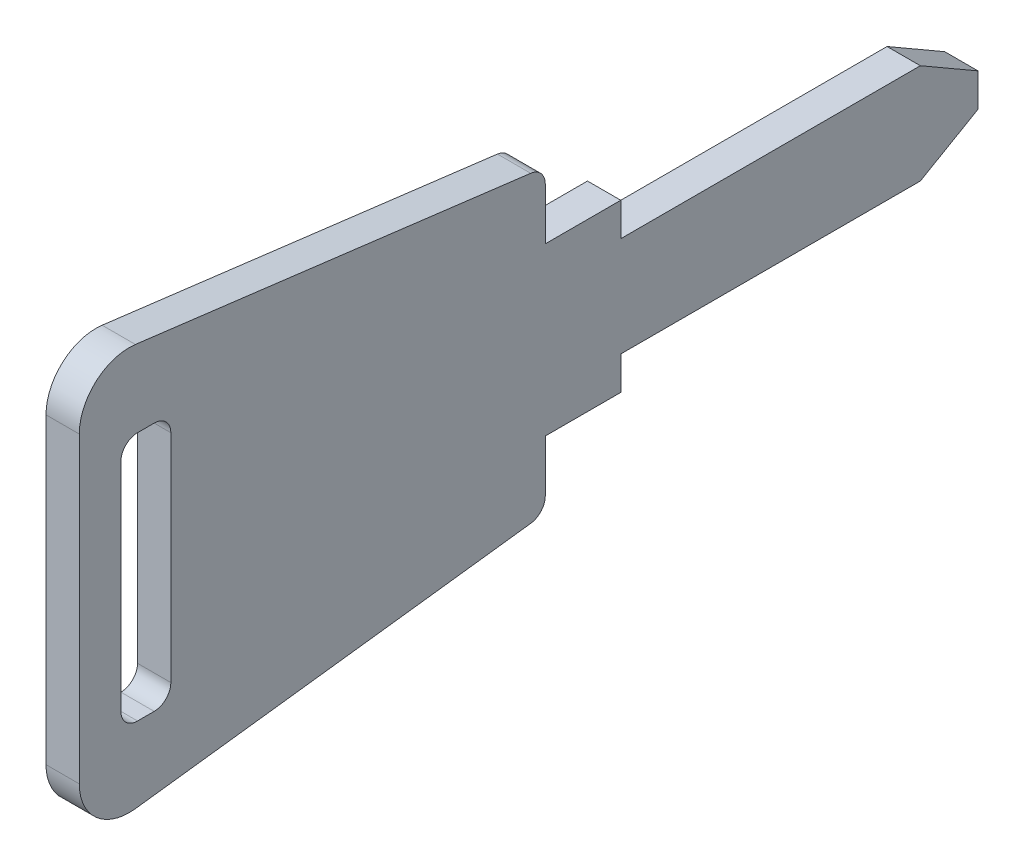
ISO-10303-21;
HEADER;
FILE_DESCRIPTION(('STEP AP214'),'2;1');
FILE_NAME('part.step','',(''),(''),'','','');
FILE_SCHEMA(('AUTOMOTIVE_DESIGN { 1 0 10303 214 1 1 1 1 }'));
ENDSEC;
DATA;
#1=APPLICATION_CONTEXT('core data for automotive mechanical design processes');
#2=APPLICATION_PROTOCOL_DEFINITION('international standard','automotive_design',2000,#1);
#3=PRODUCT_CONTEXT('',#1,'mechanical');
#4=PRODUCT('Part','Part','',(#3));
#5=PRODUCT_RELATED_PRODUCT_CATEGORY('part','',(#4));
#6=PRODUCT_DEFINITION_FORMATION('','',#4);
#7=PRODUCT_DEFINITION_CONTEXT('part definition',#1,'design');
#8=PRODUCT_DEFINITION('design','',#6,#7);
#9=PRODUCT_DEFINITION_SHAPE('','',#8);
#10=(LENGTH_UNIT() NAMED_UNIT(*) SI_UNIT(.MILLI.,.METRE.));
#11=(NAMED_UNIT(*) PLANE_ANGLE_UNIT() SI_UNIT($,.RADIAN.));
#12=(NAMED_UNIT(*) SI_UNIT($,.STERADIAN.) SOLID_ANGLE_UNIT());
#13=UNCERTAINTY_MEASURE_WITH_UNIT(LENGTH_MEASURE(1.E-05),#10,'distance_accuracy_value','');
#14=(GEOMETRIC_REPRESENTATION_CONTEXT(3) GLOBAL_UNCERTAINTY_ASSIGNED_CONTEXT((#13)) GLOBAL_UNIT_ASSIGNED_CONTEXT((#10,
#11,#12)) REPRESENTATION_CONTEXT('',''));
#15=CARTESIAN_POINT('',(0.,0.,0.));
#16=DIRECTION('',(0.,0.,1.));
#17=DIRECTION('',(1.,0.,0.));
#18=AXIS2_PLACEMENT_3D('',#15,#16,#17);
#19=CARTESIAN_POINT('',(2.,8.11721778146268,-27.));
#20=DIRECTION('',(-1.,0.,0.));
#21=DIRECTION('',(0.,0.,1.));
#22=AXIS2_PLACEMENT_3D('',#19,#20,#21);
#23=CYLINDRICAL_SURFACE('',#22,1.);
#24=CARTESIAN_POINT('',(0.,8.11721778146268,-27.));
#25=DIRECTION('',(1.,0.,0.));
#26=DIRECTION('',(0.,0.,-1.));
#27=AXIS2_PLACEMENT_3D('',#24,#25,#26);
#28=CIRCLE('',#27,1.);
#29=CARTESIAN_POINT('',(0.,9.10949565817635,-27.1240347345892));
#30=VERTEX_POINT('',#29);
#31=CARTESIAN_POINT('',(0.,8.11721778146268,-28.));
#32=VERTEX_POINT('',#31);
#33=EDGE_CURVE('E262',#30,#32,#28,.F.);
#34=ORIENTED_EDGE('',*,*,#33,.F.);
#35=DIRECTION('',(-1.,0.,0.));
#36=VECTOR('',#35,1.);
#37=CARTESIAN_POINT('',(2.,9.10949565817635,-27.1240347345892));
#38=LINE('',#37,#36);
#39=CARTESIAN_POINT('',(2.,9.10949565817635,-27.1240347345892));
#40=VERTEX_POINT('',#39);
#41=EDGE_CURVE('E11',#40,#30,#38,.T.);
#42=ORIENTED_EDGE('',*,*,#41,.F.);
#43=CARTESIAN_POINT('',(2.,8.11721778146268,-27.));
#44=DIRECTION('',(1.,0.,0.));
#45=DIRECTION('',(0.,0.,-1.));
#46=AXIS2_PLACEMENT_3D('',#43,#44,#45);
#47=CIRCLE('',#46,1.);
#48=CARTESIAN_POINT('',(2.,8.11721778146268,-28.));
#49=VERTEX_POINT('',#48);
#50=EDGE_CURVE('E274',#40,#49,#47,.F.);
#51=ORIENTED_EDGE('',*,*,#50,.T.);
#52=DIRECTION('',(-1.,0.,0.));
#53=VECTOR('',#52,1.);
#54=CARTESIAN_POINT('',(2.,8.11721778146268,-28.));
#55=LINE('',#54,#53);
#56=EDGE_CURVE('E321',#49,#32,#55,.T.);
#57=ORIENTED_EDGE('',*,*,#56,.T.);
#58=EDGE_LOOP('',(#34,#42,#51,#57));
#59=FACE_BOUND('',#58,.T.);
#60=ADVANCED_FACE('F34',(#59),#23,.T.);
#61=CARTESIAN_POINT('',(2.,12.3076923076923,-1.53846153846154));
#62=DIRECTION('',(0.,0.992277876713668,-0.124034734589208));
#63=DIRECTION('',(0.,0.124034734589208,0.992277876713668));
#64=AXIS2_PLACEMENT_3D('',#61,#62,#63);
#65=PLANE('',#64);
#66=DIRECTION('',(0.,-0.124034734589208,-0.992277876713668));
#67=VECTOR('',#66,1.);
#68=CARTESIAN_POINT('',(0.,12.3076923076923,-1.53846153846154));
#69=LINE('',#68,#67);
#70=CARTESIAN_POINT('',(0.,12.078486974529,-3.37210420376765));
#71=VERTEX_POINT('',#70);
#72=EDGE_CURVE('E324',#71,#30,#69,.T.);
#73=ORIENTED_EDGE('',*,*,#72,.F.);
#74=DIRECTION('',(-1.,0.,0.));
#75=VECTOR('',#74,1.);
#76=CARTESIAN_POINT('',(2.,12.078486974529,-3.37210420376765));
#77=LINE('',#76,#75);
#78=CARTESIAN_POINT('',(2.,12.078486974529,-3.37210420376765));
#79=VERTEX_POINT('',#78);
#80=EDGE_CURVE('E41',#79,#71,#77,.T.);
#81=ORIENTED_EDGE('',*,*,#80,.F.);
#82=DIRECTION('',(0.,-0.124034734589208,-0.992277876713668));
#83=VECTOR('',#82,1.);
#84=CARTESIAN_POINT('',(2.,12.3076923076923,-1.53846153846154));
#85=LINE('',#84,#83);
#86=EDGE_CURVE('E277',#79,#40,#85,.T.);
#87=ORIENTED_EDGE('',*,*,#86,.T.);
#88=ORIENTED_EDGE('',*,*,#41,.T.);
#89=EDGE_LOOP('',(#73,#81,#87,#88));
#90=FACE_BOUND('',#89,.T.);
#91=ADVANCED_FACE('F413',(#90),#65,.T.);
#92=CARTESIAN_POINT('',(2.,9.10165334438804,-3.));
#93=DIRECTION('',(-1.,0.,0.));
#94=DIRECTION('',(0.,0.,1.));
#95=AXIS2_PLACEMENT_3D('',#92,#93,#94);
#96=CYLINDRICAL_SURFACE('',#95,3.);
#97=CARTESIAN_POINT('',(0.,9.10165334438804,-3.));
#98=DIRECTION('',(1.,0.,0.));
#99=DIRECTION('',(0.,0.,-1.));
#100=AXIS2_PLACEMENT_3D('',#97,#98,#99);
#101=CIRCLE('',#100,3.);
#102=CARTESIAN_POINT('',(0.,9.10165334438802,0.));
#103=VERTEX_POINT('',#102);
#104=EDGE_CURVE('E327',#71,#103,#101,.T.);
#105=ORIENTED_EDGE('',*,*,#104,.T.);
#106=DIRECTION('',(-1.,0.,0.));
#107=VECTOR('',#106,1.);
#108=CARTESIAN_POINT('',(2.,9.10165334438802,0.));
#109=LINE('',#108,#107);
#110=CARTESIAN_POINT('',(2.,9.10165334438802,0.));
#111=VERTEX_POINT('',#110);
#112=EDGE_CURVE('E403',#111,#103,#109,.T.);
#113=ORIENTED_EDGE('',*,*,#112,.F.);
#114=CARTESIAN_POINT('',(2.,9.10165334438804,-3.));
#115=DIRECTION('',(1.,0.,0.));
#116=DIRECTION('',(0.,0.,-1.));
#117=AXIS2_PLACEMENT_3D('',#114,#115,#116);
#118=CIRCLE('',#117,3.);
#119=EDGE_CURVE('E281',#79,#111,#118,.T.);
#120=ORIENTED_EDGE('',*,*,#119,.F.);
#121=ORIENTED_EDGE('',*,*,#80,.T.);
#122=EDGE_LOOP('',(#105,#113,#120,#121));
#123=FACE_BOUND('',#122,.T.);
#124=ADVANCED_FACE('F407',(#123),#96,.T.);
#125=CARTESIAN_POINT('',(2.,0.,0.));
#126=DIRECTION('',(0.,0.,1.));
#127=DIRECTION('',(1.,0.,0.));
#128=AXIS2_PLACEMENT_3D('',#125,#126,#127);
#129=PLANE('',#128);
#130=DIRECTION('',(0.,1.,0.));
#131=VECTOR('',#130,1.);
#132=CARTESIAN_POINT('',(0.,0.,0.));
#133=LINE('',#132,#131);
#134=CARTESIAN_POINT('',(0.,-9.10165334438802,0.));
#135=VERTEX_POINT('',#134);
#136=EDGE_CURVE('E330',#135,#103,#133,.T.);
#137=ORIENTED_EDGE('',*,*,#136,.F.);
#138=DIRECTION('',(-1.,0.,0.));
#139=VECTOR('',#138,1.);
#140=CARTESIAN_POINT('',(2.,-9.10165334438802,0.));
#141=LINE('',#140,#139);
#142=CARTESIAN_POINT('',(2.,-9.10165334438802,0.));
#143=VERTEX_POINT('',#142);
#144=EDGE_CURVE('E401',#143,#135,#141,.T.);
#145=ORIENTED_EDGE('',*,*,#144,.F.);
#146=DIRECTION('',(0.,1.,0.));
#147=VECTOR('',#146,1.);
#148=CARTESIAN_POINT('',(2.,0.,0.));
#149=LINE('',#148,#147);
#150=EDGE_CURVE('E283',#143,#111,#149,.T.);
#151=ORIENTED_EDGE('',*,*,#150,.T.);
#152=ORIENTED_EDGE('',*,*,#112,.T.);
#153=EDGE_LOOP('',(#137,#145,#151,#152));
#154=FACE_BOUND('',#153,.T.);
#155=ADVANCED_FACE('F482',(#154),#129,.T.);
#156=CARTESIAN_POINT('',(2.,-9.10165334438804,-3.));
#157=DIRECTION('',(-1.,0.,0.));
#158=DIRECTION('',(0.,0.,1.));
#159=AXIS2_PLACEMENT_3D('',#156,#157,#158);
#160=CYLINDRICAL_SURFACE('',#159,3.);
#161=CARTESIAN_POINT('',(0.,-9.10165334438804,-3.));
#162=DIRECTION('',(1.,0.,0.));
#163=DIRECTION('',(0.,0.,-1.));
#164=AXIS2_PLACEMENT_3D('',#161,#162,#163);
#165=CIRCLE('',#164,3.);
#166=CARTESIAN_POINT('',(0.,-12.078486974529,-3.37210420376765));
#167=VERTEX_POINT('',#166);
#168=EDGE_CURVE('E333',#167,#135,#165,.F.);
#169=ORIENTED_EDGE('',*,*,#168,.F.);
#170=DIRECTION('',(-1.,0.,0.));
#171=VECTOR('',#170,1.);
#172=CARTESIAN_POINT('',(2.,-12.078486974529,-3.37210420376765));
#173=LINE('',#172,#171);
#174=CARTESIAN_POINT('',(2.,-12.078486974529,-3.37210420376765));
#175=VERTEX_POINT('',#174);
#176=EDGE_CURVE('E399',#175,#167,#173,.T.);
#177=ORIENTED_EDGE('',*,*,#176,.F.);
#178=CARTESIAN_POINT('',(2.,-9.10165334438804,-3.));
#179=DIRECTION('',(1.,0.,0.));
#180=DIRECTION('',(0.,0.,-1.));
#181=AXIS2_PLACEMENT_3D('',#178,#179,#180);
#182=CIRCLE('',#181,3.);
#183=EDGE_CURVE('E286',#175,#143,#182,.F.);
#184=ORIENTED_EDGE('',*,*,#183,.T.);
#185=ORIENTED_EDGE('',*,*,#144,.T.);
#186=EDGE_LOOP('',(#169,#177,#184,#185));
#187=FACE_BOUND('',#186,.T.);
#188=ADVANCED_FACE('F479',(#187),#160,.T.);
#189=CARTESIAN_POINT('',(2.,-12.3076923076923,-1.53846153846154));
#190=DIRECTION('',(0.,0.992277876713668,0.124034734589208));
#191=DIRECTION('',(0.,-0.124034734589208,0.992277876713668));
#192=AXIS2_PLACEMENT_3D('',#189,#190,#191);
#193=PLANE('',#192);
#194=DIRECTION('',(0.,0.124034734589208,-0.992277876713668));
#195=VECTOR('',#194,1.);
#196=CARTESIAN_POINT('',(0.,-12.3076923076923,-1.53846153846154));
#197=LINE('',#196,#195);
#198=CARTESIAN_POINT('',(0.,-9.10949565817635,-27.1240347345892));
#199=VERTEX_POINT('',#198);
#200=EDGE_CURVE('E336',#167,#199,#197,.T.);
#201=ORIENTED_EDGE('',*,*,#200,.T.);
#202=DIRECTION('',(-1.,0.,0.));
#203=VECTOR('',#202,1.);
#204=CARTESIAN_POINT('',(2.,-9.10949565817635,-27.1240347345892));
#205=LINE('',#204,#203);
#206=CARTESIAN_POINT('',(2.,-9.10949565817635,-27.1240347345892));
#207=VERTEX_POINT('',#206);
#208=EDGE_CURVE('E396',#207,#199,#205,.T.);
#209=ORIENTED_EDGE('',*,*,#208,.F.);
#210=DIRECTION('',(0.,0.124034734589208,-0.992277876713668));
#211=VECTOR('',#210,1.);
#212=CARTESIAN_POINT('',(2.,-12.3076923076923,-1.53846153846154));
#213=LINE('',#212,#211);
#214=EDGE_CURVE('E289',#175,#207,#213,.T.);
#215=ORIENTED_EDGE('',*,*,#214,.F.);
#216=ORIENTED_EDGE('',*,*,#176,.T.);
#217=EDGE_LOOP('',(#201,#209,#215,#216));
#218=FACE_BOUND('',#217,.T.);
#219=ADVANCED_FACE('F476',(#218),#193,.F.);
#220=CARTESIAN_POINT('',(2.,-8.11721778146268,-27.));
#221=DIRECTION('',(-1.,0.,0.));
#222=DIRECTION('',(0.,0.,1.));
#223=AXIS2_PLACEMENT_3D('',#220,#221,#222);
#224=CYLINDRICAL_SURFACE('',#223,1.);
#225=CARTESIAN_POINT('',(0.,-8.11721778146268,-27.));
#226=DIRECTION('',(1.,0.,0.));
#227=DIRECTION('',(0.,0.,-1.));
#228=AXIS2_PLACEMENT_3D('',#225,#226,#227);
#229=CIRCLE('',#228,1.);
#230=CARTESIAN_POINT('',(0.,-8.11721778146268,-28.));
#231=VERTEX_POINT('',#230);
#232=EDGE_CURVE('E338',#199,#231,#229,.T.);
#233=ORIENTED_EDGE('',*,*,#232,.T.);
#234=DIRECTION('',(-1.,0.,0.));
#235=VECTOR('',#234,1.);
#236=CARTESIAN_POINT('',(2.,-8.11721778146268,-28.));
#237=LINE('',#236,#235);
#238=CARTESIAN_POINT('',(2.,-8.11721778146268,-28.));
#239=VERTEX_POINT('',#238);
#240=EDGE_CURVE('E393',#239,#231,#237,.T.);
#241=ORIENTED_EDGE('',*,*,#240,.F.);
#242=CARTESIAN_POINT('',(2.,-8.11721778146268,-27.));
#243=DIRECTION('',(1.,0.,0.));
#244=DIRECTION('',(0.,0.,-1.));
#245=AXIS2_PLACEMENT_3D('',#242,#243,#244);
#246=CIRCLE('',#245,1.);
#247=EDGE_CURVE('E291',#207,#239,#246,.T.);
#248=ORIENTED_EDGE('',*,*,#247,.F.);
#249=ORIENTED_EDGE('',*,*,#208,.T.);
#250=EDGE_LOOP('',(#233,#241,#248,#249));
#251=FACE_BOUND('',#250,.T.);
#252=ADVANCED_FACE('F471',(#251),#224,.T.);
#253=CARTESIAN_POINT('',(2.,0.,-28.));
#254=DIRECTION('',(0.,0.,1.));
#255=DIRECTION('',(0.,-1.,0.));
#256=AXIS2_PLACEMENT_3D('',#253,#254,#255);
#257=PLANE('',#256);
#258=DIRECTION('',(0.,1.,0.));
#259=VECTOR('',#258,1.);
#260=CARTESIAN_POINT('',(0.,0.,-28.));
#261=LINE('',#260,#259);
#262=CARTESIAN_POINT('',(0.,-5.,-28.));
#263=VERTEX_POINT('',#262);
#264=EDGE_CURVE('E340',#231,#263,#261,.T.);
#265=ORIENTED_EDGE('',*,*,#264,.T.);
#266=DIRECTION('',(-1.,0.,0.));
#267=VECTOR('',#266,1.);
#268=CARTESIAN_POINT('',(2.,-5.,-28.));
#269=LINE('',#268,#267);
#270=CARTESIAN_POINT('',(2.,-5.,-28.));
#271=VERTEX_POINT('',#270);
#272=EDGE_CURVE('E390',#271,#263,#269,.T.);
#273=ORIENTED_EDGE('',*,*,#272,.F.);
#274=DIRECTION('',(0.,1.,0.));
#275=VECTOR('',#274,1.);
#276=CARTESIAN_POINT('',(2.,0.,-28.));
#277=LINE('',#276,#275);
#278=EDGE_CURVE('E293',#239,#271,#277,.T.);
#279=ORIENTED_EDGE('',*,*,#278,.F.);
#280=ORIENTED_EDGE('',*,*,#240,.T.);
#281=EDGE_LOOP('',(#265,#273,#279,#280));
#282=FACE_BOUND('',#281,.T.);
#283=ADVANCED_FACE('F465',(#282),#257,.F.);
#284=CARTESIAN_POINT('',(2.,-5.,0.));
#285=DIRECTION('',(0.,1.,0.));
#286=DIRECTION('',(0.,0.,1.));
#287=AXIS2_PLACEMENT_3D('',#284,#285,#286);
#288=PLANE('',#287);
#289=DIRECTION('',(0.,0.,-1.));
#290=VECTOR('',#289,1.);
#291=CARTESIAN_POINT('',(0.,-5.,0.));
#292=LINE('',#291,#290);
#293=CARTESIAN_POINT('',(0.,-5.00000000000001,-32.5358983848623));
#294=VERTEX_POINT('',#293);
#295=EDGE_CURVE('E342',#263,#294,#292,.T.);
#296=ORIENTED_EDGE('',*,*,#295,.T.);
#297=DIRECTION('',(-1.,0.,0.));
#298=VECTOR('',#297,1.);
#299=CARTESIAN_POINT('',(2.,-5.00000000000001,-32.5358983848623));
#300=LINE('',#299,#298);
#301=CARTESIAN_POINT('',(2.,-5.00000000000001,-32.5358983848623));
#302=VERTEX_POINT('',#301);
#303=EDGE_CURVE('E387',#302,#294,#300,.T.);
#304=ORIENTED_EDGE('',*,*,#303,.F.);
#305=DIRECTION('',(0.,0.,-1.));
#306=VECTOR('',#305,1.);
#307=CARTESIAN_POINT('',(2.,-5.,0.));
#308=LINE('',#307,#306);
#309=EDGE_CURVE('E295',#271,#302,#308,.T.);
#310=ORIENTED_EDGE('',*,*,#309,.F.);
#311=ORIENTED_EDGE('',*,*,#272,.T.);
#312=EDGE_LOOP('',(#296,#304,#310,#311));
#313=FACE_BOUND('',#312,.T.);
#314=ADVANCED_FACE('F461',(#313),#288,.F.);
#315=CARTESIAN_POINT('',(2.,0.,-32.5358983848623));
#316=DIRECTION('',(0.,0.,1.));
#317=DIRECTION('',(1.,0.,0.));
#318=AXIS2_PLACEMENT_3D('',#315,#316,#317);
#319=PLANE('',#318);
#320=DIRECTION('',(0.,1.,0.));
#321=VECTOR('',#320,1.);
#322=CARTESIAN_POINT('',(0.,0.,-32.5358983848623));
#323=LINE('',#322,#321);
#324=CARTESIAN_POINT('',(0.,-3.,-32.5358983848623));
#325=VERTEX_POINT('',#324);
#326=EDGE_CURVE('E344',#294,#325,#323,.T.);
#327=ORIENTED_EDGE('',*,*,#326,.T.);
#328=DIRECTION('',(-1.,0.,0.));
#329=VECTOR('',#328,1.);
#330=CARTESIAN_POINT('',(2.,-3.,-32.5358983848623));
#331=LINE('',#330,#329);
#332=CARTESIAN_POINT('',(2.,-3.,-32.5358983848623));
#333=VERTEX_POINT('',#332);
#334=EDGE_CURVE('E384',#333,#325,#331,.T.);
#335=ORIENTED_EDGE('',*,*,#334,.F.);
#336=DIRECTION('',(0.,1.,0.));
#337=VECTOR('',#336,1.);
#338=CARTESIAN_POINT('',(2.,0.,-32.5358983848623));
#339=LINE('',#338,#337);
#340=EDGE_CURVE('E297',#302,#333,#339,.T.);
#341=ORIENTED_EDGE('',*,*,#340,.F.);
#342=ORIENTED_EDGE('',*,*,#303,.T.);
#343=EDGE_LOOP('',(#327,#335,#341,#342));
#344=FACE_BOUND('',#343,.T.);
#345=ADVANCED_FACE('F456',(#344),#319,.F.);
#346=CARTESIAN_POINT('',(2.,-3.,0.));
#347=DIRECTION('',(0.,1.,0.));
#348=DIRECTION('',(0.,0.,1.));
#349=AXIS2_PLACEMENT_3D('',#346,#347,#348);
#350=PLANE('',#349);
#351=DIRECTION('',(0.,0.,-1.));
#352=VECTOR('',#351,1.);
#353=CARTESIAN_POINT('',(0.,-3.,0.));
#354=LINE('',#353,#352);
#355=CARTESIAN_POINT('',(0.,-3.00000000000001,-50.5358983848623));
#356=VERTEX_POINT('',#355);
#357=EDGE_CURVE('E346',#325,#356,#354,.T.);
#358=ORIENTED_EDGE('',*,*,#357,.T.);
#359=DIRECTION('',(-1.,0.,0.));
#360=VECTOR('',#359,1.);
#361=CARTESIAN_POINT('',(2.,-3.00000000000001,-50.5358983848623));
#362=LINE('',#361,#360);
#363=CARTESIAN_POINT('',(2.,-3.00000000000001,-50.5358983848623));
#364=VERTEX_POINT('',#363);
#365=EDGE_CURVE('E381',#364,#356,#362,.T.);
#366=ORIENTED_EDGE('',*,*,#365,.F.);
#367=DIRECTION('',(0.,0.,-1.));
#368=VECTOR('',#367,1.);
#369=CARTESIAN_POINT('',(2.,-3.,0.));
#370=LINE('',#369,#368);
#371=EDGE_CURVE('E299',#333,#364,#370,.T.);
#372=ORIENTED_EDGE('',*,*,#371,.F.);
#373=ORIENTED_EDGE('',*,*,#334,.T.);
#374=EDGE_LOOP('',(#358,#366,#372,#373));
#375=FACE_BOUND('',#374,.T.);
#376=ADVANCED_FACE('F450',(#375),#350,.F.);
#377=CARTESIAN_POINT('',(2.,-24.13268590218,-13.9330127018925));
#378=DIRECTION('',(0.,0.866025403784436,0.500000000000005));
#379=DIRECTION('',(0.,-0.500000000000005,0.866025403784436));
#380=AXIS2_PLACEMENT_3D('',#377,#378,#379);
#381=PLANE('',#380);
#382=DIRECTION('',(0.,0.500000000000005,-0.866025403784436));
#383=VECTOR('',#382,1.);
#384=CARTESIAN_POINT('',(0.,-24.13268590218,-13.9330127018925));
#385=LINE('',#384,#383);
#386=CARTESIAN_POINT('',(0.,-1.,-54.));
#387=VERTEX_POINT('',#386);
#388=EDGE_CURVE('E348',#356,#387,#385,.T.);
#389=ORIENTED_EDGE('',*,*,#388,.T.);
#390=DIRECTION('',(-1.,0.,0.));
#391=VECTOR('',#390,1.);
#392=CARTESIAN_POINT('',(2.,-1.,-54.));
#393=LINE('',#392,#391);
#394=CARTESIAN_POINT('',(2.,-1.,-54.));
#395=VERTEX_POINT('',#394);
#396=EDGE_CURVE('E379',#395,#387,#393,.T.);
#397=ORIENTED_EDGE('',*,*,#396,.F.);
#398=DIRECTION('',(0.,0.500000000000005,-0.866025403784436));
#399=VECTOR('',#398,1.);
#400=CARTESIAN_POINT('',(2.,-24.13268590218,-13.9330127018925));
#401=LINE('',#400,#399);
#402=EDGE_CURVE('E301',#364,#395,#401,.T.);
#403=ORIENTED_EDGE('',*,*,#402,.F.);
#404=ORIENTED_EDGE('',*,*,#365,.T.);
#405=EDGE_LOOP('',(#389,#397,#403,#404));
#406=FACE_BOUND('',#405,.T.);
#407=ADVANCED_FACE('F446',(#406),#381,.F.);
#408=CARTESIAN_POINT('',(2.,0.,-54.));
#409=DIRECTION('',(0.,0.,-1.));
#410=DIRECTION('',(-1.,0.,0.));
#411=AXIS2_PLACEMENT_3D('',#408,#409,#410);
#412=PLANE('',#411);
#413=DIRECTION('',(0.,-1.,0.));
#414=VECTOR('',#413,1.);
#415=CARTESIAN_POINT('',(0.,0.,-54.));
#416=LINE('',#415,#414);
#417=CARTESIAN_POINT('',(0.,0.999999999999997,-54.));
#418=VERTEX_POINT('',#417);
#419=EDGE_CURVE('E351',#418,#387,#416,.T.);
#420=ORIENTED_EDGE('',*,*,#419,.F.);
#421=DIRECTION('',(-1.,0.,0.));
#422=VECTOR('',#421,1.);
#423=CARTESIAN_POINT('',(2.,0.999999999999997,-54.));
#424=LINE('',#423,#422);
#425=CARTESIAN_POINT('',(2.,0.999999999999997,-54.));
#426=VERTEX_POINT('',#425);
#427=EDGE_CURVE('E377',#426,#418,#424,.T.);
#428=ORIENTED_EDGE('',*,*,#427,.F.);
#429=DIRECTION('',(0.,-1.,0.));
#430=VECTOR('',#429,1.);
#431=CARTESIAN_POINT('',(2.,0.,-54.));
#432=LINE('',#431,#430);
#433=EDGE_CURVE('E303',#426,#395,#432,.T.);
#434=ORIENTED_EDGE('',*,*,#433,.T.);
#435=ORIENTED_EDGE('',*,*,#396,.T.);
#436=EDGE_LOOP('',(#420,#428,#434,#435));
#437=FACE_BOUND('',#436,.T.);
#438=ADVANCED_FACE('F441',(#437),#412,.T.);
#439=CARTESIAN_POINT('',(2.,24.13268590218,-13.9330127018925));
#440=DIRECTION('',(0.,0.866025403784436,-0.500000000000005));
#441=DIRECTION('',(0.,0.500000000000005,0.866025403784436));
#442=AXIS2_PLACEMENT_3D('',#439,#440,#441);
#443=PLANE('',#442);
#444=DIRECTION('',(0.,-0.500000000000005,-0.866025403784436));
#445=VECTOR('',#444,1.);
#446=CARTESIAN_POINT('',(0.,24.13268590218,-13.9330127018925));
#447=LINE('',#446,#445);
#448=CARTESIAN_POINT('',(0.,3.00000000000001,-50.5358983848623));
#449=VERTEX_POINT('',#448);
#450=EDGE_CURVE('E354',#449,#418,#447,.T.);
#451=ORIENTED_EDGE('',*,*,#450,.F.);
#452=DIRECTION('',(-1.,0.,0.));
#453=VECTOR('',#452,1.);
#454=CARTESIAN_POINT('',(2.,3.00000000000001,-50.5358983848623));
#455=LINE('',#454,#453);
#456=CARTESIAN_POINT('',(2.,3.00000000000001,-50.5358983848623));
#457=VERTEX_POINT('',#456);
#458=EDGE_CURVE('E375',#457,#449,#455,.T.);
#459=ORIENTED_EDGE('',*,*,#458,.F.);
#460=DIRECTION('',(0.,-0.500000000000005,-0.866025403784436));
#461=VECTOR('',#460,1.);
#462=CARTESIAN_POINT('',(2.,24.13268590218,-13.9330127018925));
#463=LINE('',#462,#461);
#464=EDGE_CURVE('E306',#457,#426,#463,.T.);
#465=ORIENTED_EDGE('',*,*,#464,.T.);
#466=ORIENTED_EDGE('',*,*,#427,.T.);
#467=EDGE_LOOP('',(#451,#459,#465,#466));
#468=FACE_BOUND('',#467,.T.);
#469=ADVANCED_FACE('F436',(#468),#443,.T.);
#470=CARTESIAN_POINT('',(2.,3.,0.));
#471=DIRECTION('',(0.,1.,0.));
#472=DIRECTION('',(0.,0.,1.));
#473=AXIS2_PLACEMENT_3D('',#470,#471,#472);
#474=PLANE('',#473);
#475=DIRECTION('',(0.,0.,-1.));
#476=VECTOR('',#475,1.);
#477=CARTESIAN_POINT('',(0.,3.,0.));
#478=LINE('',#477,#476);
#479=CARTESIAN_POINT('',(0.,3.,-32.5358983848623));
#480=VERTEX_POINT('',#479);
#481=EDGE_CURVE('E357',#480,#449,#478,.T.);
#482=ORIENTED_EDGE('',*,*,#481,.F.);
#483=DIRECTION('',(-1.,0.,0.));
#484=VECTOR('',#483,1.);
#485=CARTESIAN_POINT('',(2.,3.,-32.5358983848623));
#486=LINE('',#485,#484);
#487=CARTESIAN_POINT('',(2.,3.,-32.5358983848623));
#488=VERTEX_POINT('',#487);
#489=EDGE_CURVE('E373',#488,#480,#486,.T.);
#490=ORIENTED_EDGE('',*,*,#489,.F.);
#491=DIRECTION('',(0.,0.,-1.));
#492=VECTOR('',#491,1.);
#493=CARTESIAN_POINT('',(2.,3.,0.));
#494=LINE('',#493,#492);
#495=EDGE_CURVE('E309',#488,#457,#494,.T.);
#496=ORIENTED_EDGE('',*,*,#495,.T.);
#497=ORIENTED_EDGE('',*,*,#458,.T.);
#498=EDGE_LOOP('',(#482,#490,#496,#497));
#499=FACE_BOUND('',#498,.T.);
#500=ADVANCED_FACE('F432',(#499),#474,.T.);
#501=CARTESIAN_POINT('',(2.,0.,-32.5358983848623));
#502=DIRECTION('',(0.,0.,-1.));
#503=DIRECTION('',(-1.,0.,0.));
#504=AXIS2_PLACEMENT_3D('',#501,#502,#503);
#505=PLANE('',#504);
#506=DIRECTION('',(0.,-1.,0.));
#507=VECTOR('',#506,1.);
#508=CARTESIAN_POINT('',(0.,0.,-32.5358983848623));
#509=LINE('',#508,#507);
#510=CARTESIAN_POINT('',(0.,5.00000000000001,-32.5358983848623));
#511=VERTEX_POINT('',#510);
#512=EDGE_CURVE('E360',#511,#480,#509,.T.);
#513=ORIENTED_EDGE('',*,*,#512,.F.);
#514=DIRECTION('',(-1.,0.,0.));
#515=VECTOR('',#514,1.);
#516=CARTESIAN_POINT('',(2.,5.00000000000001,-32.5358983848623));
#517=LINE('',#516,#515);
#518=CARTESIAN_POINT('',(2.,5.00000000000001,-32.5358983848623));
#519=VERTEX_POINT('',#518);
#520=EDGE_CURVE('E371',#519,#511,#517,.T.);
#521=ORIENTED_EDGE('',*,*,#520,.F.);
#522=DIRECTION('',(0.,-1.,0.));
#523=VECTOR('',#522,1.);
#524=CARTESIAN_POINT('',(2.,0.,-32.5358983848623));
#525=LINE('',#524,#523);
#526=EDGE_CURVE('E312',#519,#488,#525,.T.);
#527=ORIENTED_EDGE('',*,*,#526,.T.);
#528=ORIENTED_EDGE('',*,*,#489,.T.);
#529=EDGE_LOOP('',(#513,#521,#527,#528));
#530=FACE_BOUND('',#529,.T.);
#531=ADVANCED_FACE('F428',(#530),#505,.T.);
#532=CARTESIAN_POINT('',(2.,5.,0.));
#533=DIRECTION('',(0.,1.,0.));
#534=DIRECTION('',(0.,0.,1.));
#535=AXIS2_PLACEMENT_3D('',#532,#533,#534);
#536=PLANE('',#535);
#537=DIRECTION('',(0.,0.,-1.));
#538=VECTOR('',#537,1.);
#539=CARTESIAN_POINT('',(0.,5.,0.));
#540=LINE('',#539,#538);
#541=CARTESIAN_POINT('',(0.,5.,-28.));
#542=VERTEX_POINT('',#541);
#543=EDGE_CURVE('E363',#542,#511,#540,.T.);
#544=ORIENTED_EDGE('',*,*,#543,.F.);
#545=DIRECTION('',(-1.,0.,0.));
#546=VECTOR('',#545,1.);
#547=CARTESIAN_POINT('',(2.,5.,-28.));
#548=LINE('',#547,#546);
#549=CARTESIAN_POINT('',(2.,5.,-28.));
#550=VERTEX_POINT('',#549);
#551=EDGE_CURVE('E369',#550,#542,#548,.T.);
#552=ORIENTED_EDGE('',*,*,#551,.F.);
#553=DIRECTION('',(0.,0.,-1.));
#554=VECTOR('',#553,1.);
#555=CARTESIAN_POINT('',(2.,5.,0.));
#556=LINE('',#555,#554);
#557=EDGE_CURVE('E315',#550,#519,#556,.T.);
#558=ORIENTED_EDGE('',*,*,#557,.T.);
#559=ORIENTED_EDGE('',*,*,#520,.T.);
#560=EDGE_LOOP('',(#544,#552,#558,#559));
#561=FACE_BOUND('',#560,.T.);
#562=ADVANCED_FACE('F424',(#561),#536,.T.);
#563=CARTESIAN_POINT('',(2.,0.,-28.));
#564=DIRECTION('',(0.,0.,-1.));
#565=DIRECTION('',(0.,1.,0.));
#566=AXIS2_PLACEMENT_3D('',#563,#564,#565);
#567=PLANE('',#566);
#568=DIRECTION('',(0.,-1.,0.));
#569=VECTOR('',#568,1.);
#570=CARTESIAN_POINT('',(0.,0.,-28.));
#571=LINE('',#570,#569);
#572=EDGE_CURVE('E278',#32,#542,#571,.T.);
#573=ORIENTED_EDGE('',*,*,#572,.F.);
#574=ORIENTED_EDGE('',*,*,#56,.F.);
#575=DIRECTION('',(0.,-1.,0.));
#576=VECTOR('',#575,1.);
#577=CARTESIAN_POINT('',(2.,0.,-28.));
#578=LINE('',#577,#576);
#579=EDGE_CURVE('E318',#49,#550,#578,.T.);
#580=ORIENTED_EDGE('',*,*,#579,.T.);
#581=ORIENTED_EDGE('',*,*,#551,.T.);
#582=EDGE_LOOP('',(#573,#574,#580,#581));
#583=FACE_BOUND('',#582,.T.);
#584=ADVANCED_FACE('F419',(#583),#567,.T.);
#585=CARTESIAN_POINT('',(2.,0.,0.));
#586=DIRECTION('',(1.,0.,0.));
#587=DIRECTION('',(0.,0.,-1.));
#588=AXIS2_PLACEMENT_3D('',#585,#586,#587);
#589=PLANE('',#588);
#590=CARTESIAN_POINT('',(2.,-6.57848697452904,-4.5));
#591=DIRECTION('',(1.,0.,0.));
#592=DIRECTION('',(0.,0.,1.));
#593=AXIS2_PLACEMENT_3D('',#590,#591,#592);
#594=CIRCLE('',#593,1.);
#595=CARTESIAN_POINT('',(2.,-7.57848697452904,-4.49999999999999));
#596=VERTEX_POINT('',#595);
#597=CARTESIAN_POINT('',(2.,-6.57848697452904,-5.5));
#598=VERTEX_POINT('',#597);
#599=EDGE_CURVE('E48',#596,#598,#594,.T.);
#600=ORIENTED_EDGE('',*,*,#599,.F.);
#601=DIRECTION('',(0.,0.,-1.));
#602=VECTOR('',#601,1.);
#603=CARTESIAN_POINT('',(2.,-7.57848697452904,-4.49999999999999));
#604=LINE('',#603,#602);
#605=CARTESIAN_POINT('',(2.,-7.57848697452904,-3.50000000000001));
#606=VERTEX_POINT('',#605);
#607=EDGE_CURVE('E224',#606,#596,#604,.T.);
#608=ORIENTED_EDGE('',*,*,#607,.F.);
#609=CARTESIAN_POINT('',(2.,-6.57848697452904,-3.5));
#610=DIRECTION('',(1.,0.,0.));
#611=DIRECTION('',(0.,0.,-1.));
#612=AXIS2_PLACEMENT_3D('',#609,#610,#611);
#613=CIRCLE('',#612,1.);
#614=CARTESIAN_POINT('',(2.,-6.57848697452904,-2.5));
#615=VERTEX_POINT('',#614);
#616=EDGE_CURVE('E227',#615,#606,#613,.T.);
#617=ORIENTED_EDGE('',*,*,#616,.F.);
#618=DIRECTION('',(0.,-1.,0.));
#619=VECTOR('',#618,1.);
#620=CARTESIAN_POINT('',(2.,-6.57848697452904,-2.5));
#621=LINE('',#620,#619);
#622=CARTESIAN_POINT('',(2.,6.42151302547095,-2.5));
#623=VERTEX_POINT('',#622);
#624=EDGE_CURVE('E255',#623,#615,#621,.T.);
#625=ORIENTED_EDGE('',*,*,#624,.F.);
#626=CARTESIAN_POINT('',(2.,6.42151302547096,-3.5));
#627=DIRECTION('',(1.,0.,0.));
#628=DIRECTION('',(0.,0.,-1.));
#629=AXIS2_PLACEMENT_3D('',#626,#627,#628);
#630=CIRCLE('',#629,1.);
#631=CARTESIAN_POINT('',(2.,7.42151302547096,-3.50000000000001));
#632=VERTEX_POINT('',#631);
#633=EDGE_CURVE('E252',#632,#623,#630,.T.);
#634=ORIENTED_EDGE('',*,*,#633,.F.);
#635=DIRECTION('',(0.,0.,1.));
#636=VECTOR('',#635,1.);
#637=CARTESIAN_POINT('',(2.,7.42151302547096,-4.49999999999999));
#638=LINE('',#637,#636);
#639=CARTESIAN_POINT('',(2.,7.42151302547096,-4.49999999999999));
#640=VERTEX_POINT('',#639);
#641=EDGE_CURVE('E249',#640,#632,#638,.T.);
#642=ORIENTED_EDGE('',*,*,#641,.F.);
#643=CARTESIAN_POINT('',(2.,6.42151302547096,-4.5));
#644=DIRECTION('',(1.,0.,0.));
#645=DIRECTION('',(0.,0.,-1.));
#646=AXIS2_PLACEMENT_3D('',#643,#644,#645);
#647=CIRCLE('',#646,1.);
#648=CARTESIAN_POINT('',(2.,6.42151302547095,-5.5));
#649=VERTEX_POINT('',#648);
#650=EDGE_CURVE('E246',#649,#640,#647,.T.);
#651=ORIENTED_EDGE('',*,*,#650,.F.);
#652=DIRECTION('',(0.,1.,0.));
#653=VECTOR('',#652,1.);
#654=CARTESIAN_POINT('',(2.,-6.57848697452904,-5.5));
#655=LINE('',#654,#653);
#656=EDGE_CURVE('E244',#598,#649,#655,.T.);
#657=ORIENTED_EDGE('',*,*,#656,.F.);
#658=EDGE_LOOP('',(#600,#608,#617,#625,#634,#642,#651,#657));
#659=FACE_BOUND('',#658,.T.);
#660=ORIENTED_EDGE('',*,*,#50,.F.);
#661=ORIENTED_EDGE('',*,*,#86,.F.);
#662=ORIENTED_EDGE('',*,*,#119,.T.);
#663=ORIENTED_EDGE('',*,*,#150,.F.);
#664=ORIENTED_EDGE('',*,*,#183,.F.);
#665=ORIENTED_EDGE('',*,*,#214,.T.);
#666=ORIENTED_EDGE('',*,*,#247,.T.);
#667=ORIENTED_EDGE('',*,*,#278,.T.);
#668=ORIENTED_EDGE('',*,*,#309,.T.);
#669=ORIENTED_EDGE('',*,*,#340,.T.);
#670=ORIENTED_EDGE('',*,*,#371,.T.);
#671=ORIENTED_EDGE('',*,*,#402,.T.);
#672=ORIENTED_EDGE('',*,*,#433,.F.);
#673=ORIENTED_EDGE('',*,*,#464,.F.);
#674=ORIENTED_EDGE('',*,*,#495,.F.);
#675=ORIENTED_EDGE('',*,*,#526,.F.);
#676=ORIENTED_EDGE('',*,*,#557,.F.);
#677=ORIENTED_EDGE('',*,*,#579,.F.);
#678=EDGE_LOOP('',(#660,#661,#662,#663,#664,#665,#666,#667,#668,#669,#670,#671,#672,#673,#674,
#675,#676,#677));
#679=FACE_BOUND('',#678,.T.);
#680=ADVANCED_FACE('F484',(#659,#679),#589,.T.);
#681=CARTESIAN_POINT('',(0.,0.,0.));
#682=DIRECTION('',(1.,0.,0.));
#683=DIRECTION('',(0.,0.,-1.));
#684=AXIS2_PLACEMENT_3D('',#681,#682,#683);
#685=PLANE('',#684);
#686=DIRECTION('',(0.,0.,-1.));
#687=VECTOR('',#686,1.);
#688=CARTESIAN_POINT('',(0.,-7.57848697452904,-4.49999999999999));
#689=LINE('',#688,#687);
#690=CARTESIAN_POINT('',(0.,-7.57848697452904,-3.50000000000001));
#691=VERTEX_POINT('',#690);
#692=CARTESIAN_POINT('',(0.,-7.57848697452904,-4.49999999999999));
#693=VERTEX_POINT('',#692);
#694=EDGE_CURVE('E213',#691,#693,#689,.T.);
#695=ORIENTED_EDGE('',*,*,#694,.T.);
#696=CARTESIAN_POINT('',(0.,-6.57848697452904,-4.5));
#697=DIRECTION('',(1.,0.,0.));
#698=DIRECTION('',(0.,0.,1.));
#699=AXIS2_PLACEMENT_3D('',#696,#697,#698);
#700=CIRCLE('',#699,1.);
#701=CARTESIAN_POINT('',(0.,-6.57848697452904,-5.5));
#702=VERTEX_POINT('',#701);
#703=EDGE_CURVE('E207',#693,#702,#700,.T.);
#704=ORIENTED_EDGE('',*,*,#703,.T.);
#705=DIRECTION('',(0.,1.,0.));
#706=VECTOR('',#705,1.);
#707=CARTESIAN_POINT('',(0.,-6.57848697452904,-5.5));
#708=LINE('',#707,#706);
#709=CARTESIAN_POINT('',(0.,6.42151302547095,-5.5));
#710=VERTEX_POINT('',#709);
#711=EDGE_CURVE('E216',#702,#710,#708,.T.);
#712=ORIENTED_EDGE('',*,*,#711,.T.);
#713=CARTESIAN_POINT('',(0.,6.42151302547096,-4.5));
#714=DIRECTION('',(1.,0.,0.));
#715=DIRECTION('',(0.,0.,-1.));
#716=AXIS2_PLACEMENT_3D('',#713,#714,#715);
#717=CIRCLE('',#716,1.);
#718=CARTESIAN_POINT('',(0.,7.42151302547096,-4.49999999999999));
#719=VERTEX_POINT('',#718);
#720=EDGE_CURVE('E56',#710,#719,#717,.T.);
#721=ORIENTED_EDGE('',*,*,#720,.T.);
#722=DIRECTION('',(0.,0.,1.));
#723=VECTOR('',#722,1.);
#724=CARTESIAN_POINT('',(0.,7.42151302547096,-4.49999999999999));
#725=LINE('',#724,#723);
#726=CARTESIAN_POINT('',(0.,7.42151302547096,-3.50000000000001));
#727=VERTEX_POINT('',#726);
#728=EDGE_CURVE('E231',#719,#727,#725,.T.);
#729=ORIENTED_EDGE('',*,*,#728,.T.);
#730=CARTESIAN_POINT('',(0.,6.42151302547096,-3.5));
#731=DIRECTION('',(1.,0.,0.));
#732=DIRECTION('',(0.,0.,-1.));
#733=AXIS2_PLACEMENT_3D('',#730,#731,#732);
#734=CIRCLE('',#733,1.);
#735=CARTESIAN_POINT('',(0.,6.42151302547095,-2.5));
#736=VERTEX_POINT('',#735);
#737=EDGE_CURVE('E234',#727,#736,#734,.T.);
#738=ORIENTED_EDGE('',*,*,#737,.T.);
#739=DIRECTION('',(0.,-1.,0.));
#740=VECTOR('',#739,1.);
#741=CARTESIAN_POINT('',(0.,-6.57848697452904,-2.5));
#742=LINE('',#741,#740);
#743=CARTESIAN_POINT('',(0.,-6.57848697452904,-2.5));
#744=VERTEX_POINT('',#743);
#745=EDGE_CURVE('E237',#736,#744,#742,.T.);
#746=ORIENTED_EDGE('',*,*,#745,.T.);
#747=CARTESIAN_POINT('',(0.,-6.57848697452904,-3.5));
#748=DIRECTION('',(1.,0.,0.));
#749=DIRECTION('',(0.,0.,-1.));
#750=AXIS2_PLACEMENT_3D('',#747,#748,#749);
#751=CIRCLE('',#750,1.);
#752=EDGE_CURVE('E240',#744,#691,#751,.T.);
#753=ORIENTED_EDGE('',*,*,#752,.T.);
#754=EDGE_LOOP('',(#695,#704,#712,#721,#729,#738,#746,#753));
#755=FACE_BOUND('',#754,.T.);
#756=ORIENTED_EDGE('',*,*,#33,.T.);
#757=ORIENTED_EDGE('',*,*,#572,.T.);
#758=ORIENTED_EDGE('',*,*,#543,.T.);
#759=ORIENTED_EDGE('',*,*,#512,.T.);
#760=ORIENTED_EDGE('',*,*,#481,.T.);
#761=ORIENTED_EDGE('',*,*,#450,.T.);
#762=ORIENTED_EDGE('',*,*,#419,.T.);
#763=ORIENTED_EDGE('',*,*,#388,.F.);
#764=ORIENTED_EDGE('',*,*,#357,.F.);
#765=ORIENTED_EDGE('',*,*,#326,.F.);
#766=ORIENTED_EDGE('',*,*,#295,.F.);
#767=ORIENTED_EDGE('',*,*,#264,.F.);
#768=ORIENTED_EDGE('',*,*,#232,.F.);
#769=ORIENTED_EDGE('',*,*,#200,.F.);
#770=ORIENTED_EDGE('',*,*,#168,.T.);
#771=ORIENTED_EDGE('',*,*,#136,.T.);
#772=ORIENTED_EDGE('',*,*,#104,.F.);
#773=ORIENTED_EDGE('',*,*,#72,.T.);
#774=EDGE_LOOP('',(#756,#757,#758,#759,#760,#761,#762,#763,#764,#765,#766,#767,#768,#769,#770,
#771,#772,#773));
#775=FACE_BOUND('',#774,.T.);
#776=ADVANCED_FACE('F220',(#755,#775),#685,.F.);
#777=CARTESIAN_POINT('',(0.,-6.57848697452904,-4.5));
#778=DIRECTION('',(1.,0.,0.));
#779=DIRECTION('',(0.,0.,-1.));
#780=AXIS2_PLACEMENT_3D('',#777,#778,#779);
#781=CYLINDRICAL_SURFACE('',#780,1.);
#782=ORIENTED_EDGE('',*,*,#599,.T.);
#783=DIRECTION('',(1.,0.,0.));
#784=VECTOR('',#783,1.);
#785=CARTESIAN_POINT('',(0.,-6.57848697452904,-5.5));
#786=LINE('',#785,#784);
#787=EDGE_CURVE('E203',#702,#598,#786,.T.);
#788=ORIENTED_EDGE('',*,*,#787,.F.);
#789=ORIENTED_EDGE('',*,*,#703,.F.);
#790=DIRECTION('',(1.,0.,0.));
#791=VECTOR('',#790,1.);
#792=CARTESIAN_POINT('',(0.,-7.57848697452904,-4.49999999999999));
#793=LINE('',#792,#791);
#794=EDGE_CURVE('E260',#693,#596,#793,.T.);
#795=ORIENTED_EDGE('',*,*,#794,.T.);
#796=EDGE_LOOP('',(#782,#788,#789,#795));
#797=FACE_BOUND('',#796,.T.);
#798=ADVANCED_FACE('F205',(#797),#781,.F.);
#799=CARTESIAN_POINT('',(0.,-7.57848697452904,-4.49999999999999));
#800=DIRECTION('',(0.,-1.,0.));
#801=DIRECTION('',(0.,0.,-1.));
#802=AXIS2_PLACEMENT_3D('',#799,#800,#801);
#803=PLANE('',#802);
#804=ORIENTED_EDGE('',*,*,#607,.T.);
#805=ORIENTED_EDGE('',*,*,#794,.F.);
#806=ORIENTED_EDGE('',*,*,#694,.F.);
#807=DIRECTION('',(1.,0.,0.));
#808=VECTOR('',#807,1.);
#809=CARTESIAN_POINT('',(0.,-7.57848697452904,-3.50000000000001));
#810=LINE('',#809,#808);
#811=EDGE_CURVE('E263',#691,#606,#810,.T.);
#812=ORIENTED_EDGE('',*,*,#811,.T.);
#813=EDGE_LOOP('',(#804,#805,#806,#812));
#814=FACE_BOUND('',#813,.T.);
#815=ADVANCED_FACE('F560',(#814),#803,.F.);
#816=CARTESIAN_POINT('',(0.,-6.57848697452904,-3.5));
#817=DIRECTION('',(1.,0.,0.));
#818=DIRECTION('',(0.,0.,-1.));
#819=AXIS2_PLACEMENT_3D('',#816,#817,#818);
#820=CYLINDRICAL_SURFACE('',#819,1.);
#821=ORIENTED_EDGE('',*,*,#616,.T.);
#822=ORIENTED_EDGE('',*,*,#811,.F.);
#823=ORIENTED_EDGE('',*,*,#752,.F.);
#824=DIRECTION('',(1.,0.,0.));
#825=VECTOR('',#824,1.);
#826=CARTESIAN_POINT('',(0.,-6.57848697452904,-2.5));
#827=LINE('',#826,#825);
#828=EDGE_CURVE('E265',#744,#615,#827,.T.);
#829=ORIENTED_EDGE('',*,*,#828,.T.);
#830=EDGE_LOOP('',(#821,#822,#823,#829));
#831=FACE_BOUND('',#830,.T.);
#832=ADVANCED_FACE('F568',(#831),#820,.F.);
#833=CARTESIAN_POINT('',(0.,-6.57848697452904,-2.5));
#834=DIRECTION('',(0.,0.,1.));
#835=DIRECTION('',(1.,0.,0.));
#836=AXIS2_PLACEMENT_3D('',#833,#834,#835);
#837=PLANE('',#836);
#838=ORIENTED_EDGE('',*,*,#624,.T.);
#839=ORIENTED_EDGE('',*,*,#828,.F.);
#840=ORIENTED_EDGE('',*,*,#745,.F.);
#841=DIRECTION('',(1.,0.,0.));
#842=VECTOR('',#841,1.);
#843=CARTESIAN_POINT('',(0.,6.42151302547095,-2.5));
#844=LINE('',#843,#842);
#845=EDGE_CURVE('E267',#736,#623,#844,.T.);
#846=ORIENTED_EDGE('',*,*,#845,.T.);
#847=EDGE_LOOP('',(#838,#839,#840,#846));
#848=FACE_BOUND('',#847,.T.);
#849=ADVANCED_FACE('F578',(#848),#837,.F.);
#850=CARTESIAN_POINT('',(0.,6.42151302547096,-3.5));
#851=DIRECTION('',(1.,0.,0.));
#852=DIRECTION('',(0.,0.,-1.));
#853=AXIS2_PLACEMENT_3D('',#850,#851,#852);
#854=CYLINDRICAL_SURFACE('',#853,1.);
#855=ORIENTED_EDGE('',*,*,#633,.T.);
#856=ORIENTED_EDGE('',*,*,#845,.F.);
#857=ORIENTED_EDGE('',*,*,#737,.F.);
#858=DIRECTION('',(1.,0.,0.));
#859=VECTOR('',#858,1.);
#860=CARTESIAN_POINT('',(0.,7.42151302547096,-3.50000000000001));
#861=LINE('',#860,#859);
#862=EDGE_CURVE('E269',#727,#632,#861,.T.);
#863=ORIENTED_EDGE('',*,*,#862,.T.);
#864=EDGE_LOOP('',(#855,#856,#857,#863));
#865=FACE_BOUND('',#864,.T.);
#866=ADVANCED_FACE('F588',(#865),#854,.F.);
#867=CARTESIAN_POINT('',(0.,7.42151302547096,-4.49999999999999));
#868=DIRECTION('',(0.,1.,0.));
#869=DIRECTION('',(0.,0.,1.));
#870=AXIS2_PLACEMENT_3D('',#867,#868,#869);
#871=PLANE('',#870);
#872=ORIENTED_EDGE('',*,*,#641,.T.);
#873=ORIENTED_EDGE('',*,*,#862,.F.);
#874=ORIENTED_EDGE('',*,*,#728,.F.);
#875=DIRECTION('',(1.,0.,0.));
#876=VECTOR('',#875,1.);
#877=CARTESIAN_POINT('',(0.,7.42151302547096,-4.49999999999999));
#878=LINE('',#877,#876);
#879=EDGE_CURVE('E271',#719,#640,#878,.T.);
#880=ORIENTED_EDGE('',*,*,#879,.T.);
#881=EDGE_LOOP('',(#872,#873,#874,#880));
#882=FACE_BOUND('',#881,.T.);
#883=ADVANCED_FACE('F598',(#882),#871,.F.);
#884=CARTESIAN_POINT('',(0.,6.42151302547096,-4.5));
#885=DIRECTION('',(1.,0.,0.));
#886=DIRECTION('',(0.,0.,-1.));
#887=AXIS2_PLACEMENT_3D('',#884,#885,#886);
#888=CYLINDRICAL_SURFACE('',#887,1.);
#889=ORIENTED_EDGE('',*,*,#650,.T.);
#890=ORIENTED_EDGE('',*,*,#879,.F.);
#891=ORIENTED_EDGE('',*,*,#720,.F.);
#892=DIRECTION('',(1.,0.,0.));
#893=VECTOR('',#892,1.);
#894=CARTESIAN_POINT('',(0.,6.42151302547095,-5.5));
#895=LINE('',#894,#893);
#896=EDGE_CURVE('E212',#710,#649,#895,.T.);
#897=ORIENTED_EDGE('',*,*,#896,.T.);
#898=EDGE_LOOP('',(#889,#890,#891,#897));
#899=FACE_BOUND('',#898,.T.);
#900=ADVANCED_FACE('F608',(#899),#888,.F.);
#901=CARTESIAN_POINT('',(0.,-6.57848697452904,-5.5));
#902=DIRECTION('',(0.,0.,-1.));
#903=DIRECTION('',(0.,1.,0.));
#904=AXIS2_PLACEMENT_3D('',#901,#902,#903);
#905=PLANE('',#904);
#906=ORIENTED_EDGE('',*,*,#656,.T.);
#907=ORIENTED_EDGE('',*,*,#896,.F.);
#908=ORIENTED_EDGE('',*,*,#711,.F.);
#909=ORIENTED_EDGE('',*,*,#787,.T.);
#910=EDGE_LOOP('',(#906,#907,#908,#909));
#911=FACE_BOUND('',#910,.T.);
#912=ADVANCED_FACE('F217',(#911),#905,.F.);
#913=CLOSED_SHELL('',(#60,#91,#124,#155,#188,#219,#252,#283,#314,#345,#376,#407,#438,#469,#500,
#531,#562,#584,#680,#776,#798,#815,#832,#849,#866,#883,#900,#912));
#914=MANIFOLD_SOLID_BREP('B2',#913);
#915=ADVANCED_BREP_SHAPE_REPRESENTATION('',(#18,#914),#14);
#916=SHAPE_DEFINITION_REPRESENTATION(#9,#915);
ENDSEC;
END-ISO-10303-21;
